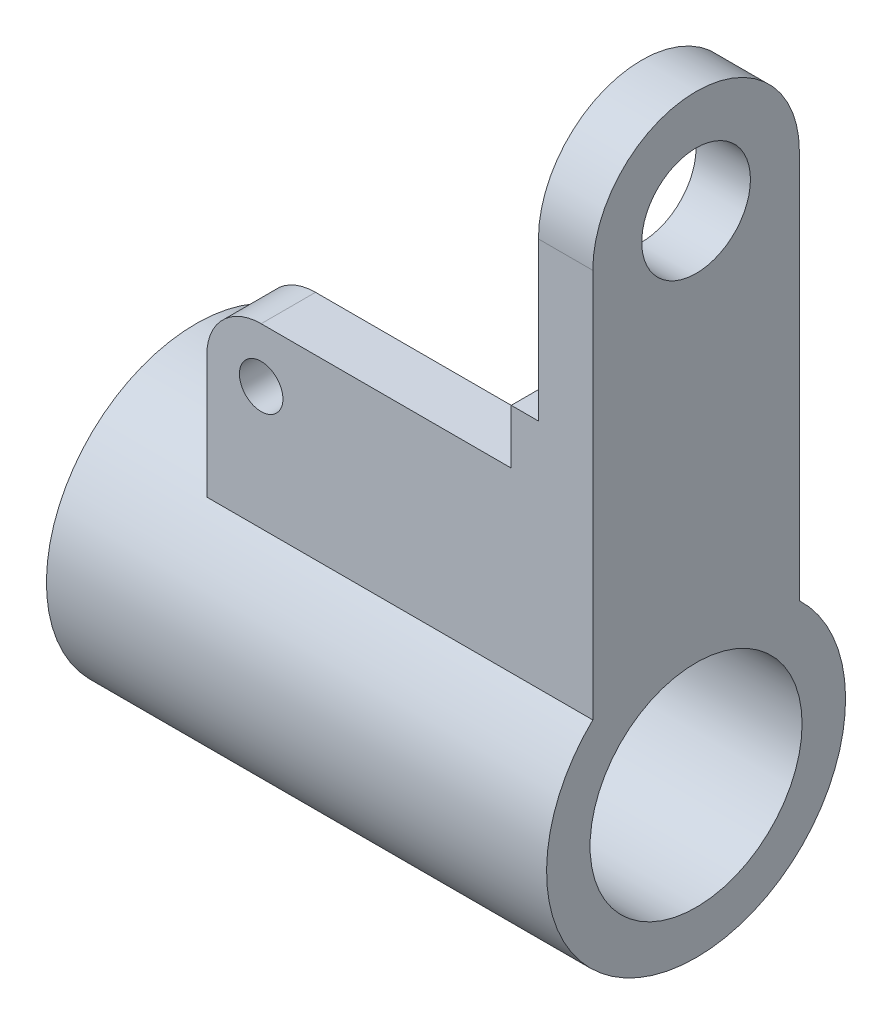
ISO-10303-21;
HEADER;
FILE_DESCRIPTION(('STEP AP214'),'2;1');
FILE_NAME('part.step','',(''),(''),'','','');
FILE_SCHEMA(('AUTOMOTIVE_DESIGN { 1 0 10303 214 1 1 1 1 }'));
ENDSEC;
DATA;
#1=APPLICATION_CONTEXT('core data for automotive mechanical design processes');
#2=APPLICATION_PROTOCOL_DEFINITION('international standard','automotive_design',2000,#1);
#3=PRODUCT_CONTEXT('',#1,'mechanical');
#4=PRODUCT('Part','Part','',(#3));
#5=PRODUCT_RELATED_PRODUCT_CATEGORY('part','',(#4));
#6=PRODUCT_DEFINITION_FORMATION('','',#4);
#7=PRODUCT_DEFINITION_CONTEXT('part definition',#1,'design');
#8=PRODUCT_DEFINITION('design','',#6,#7);
#9=PRODUCT_DEFINITION_SHAPE('','',#8);
#10=(LENGTH_UNIT() NAMED_UNIT(*) SI_UNIT(.MILLI.,.METRE.));
#11=(NAMED_UNIT(*) PLANE_ANGLE_UNIT() SI_UNIT($,.RADIAN.));
#12=(NAMED_UNIT(*) SI_UNIT($,.STERADIAN.) SOLID_ANGLE_UNIT());
#13=UNCERTAINTY_MEASURE_WITH_UNIT(LENGTH_MEASURE(1.E-05),#10,'distance_accuracy_value','');
#14=(GEOMETRIC_REPRESENTATION_CONTEXT(3) GLOBAL_UNCERTAINTY_ASSIGNED_CONTEXT((#13)) GLOBAL_UNIT_ASSIGNED_CONTEXT((#10,
#11,#12)) REPRESENTATION_CONTEXT('',''));
#15=CARTESIAN_POINT('',(0.,0.,0.));
#16=DIRECTION('',(0.,0.,1.));
#17=DIRECTION('',(1.,0.,0.));
#18=AXIS2_PLACEMENT_3D('',#15,#16,#17);
#19=CARTESIAN_POINT('',(92.,0.,0.));
#20=DIRECTION('',(-1.,0.,0.));
#21=DIRECTION('',(0.,0.,1.));
#22=AXIS2_PLACEMENT_3D('',#19,#20,#21);
#23=CYLINDRICAL_SURFACE('',#22,27.5);
#24=CARTESIAN_POINT('',(0.,0.,0.));
#25=DIRECTION('',(1.,0.,0.));
#26=DIRECTION('',(0.,0.,-1.));
#27=AXIS2_PLACEMENT_3D('',#24,#25,#26);
#28=CIRCLE('',#27,27.5);
#29=CARTESIAN_POINT('',(0.,0.,-27.5));
#30=VERTEX_POINT('',#29);
#31=EDGE_CURVE('E195',#30,#30,#28,.T.);
#32=ORIENTED_EDGE('',*,*,#31,.T.);
#33=EDGE_LOOP('',(#32));
#34=FACE_BOUND('',#33,.T.);
#35=DIRECTION('',(1.,0.,0.));
#36=VECTOR('',#35,1.);
#37=CARTESIAN_POINT('',(77.,19.8808953520711,19.));
#38=LINE('',#37,#36);
#39=CARTESIAN_POINT('',(21.,19.880895352071,19.));
#40=VERTEX_POINT('',#39);
#41=CARTESIAN_POINT('',(92.,19.880895352071,19.));
#42=VERTEX_POINT('',#41);
#43=EDGE_CURVE('E183',#40,#42,#38,.T.);
#44=ORIENTED_EDGE('',*,*,#43,.F.);
#45=CARTESIAN_POINT('',(21.,0.,0.));
#46=DIRECTION('',(1.,0.,0.));
#47=DIRECTION('',(0.,0.,1.));
#48=AXIS2_PLACEMENT_3D('',#45,#46,#47);
#49=CIRCLE('',#48,27.5);
#50=CARTESIAN_POINT('',(21.,25.9855729203726,8.99999999999999));
#51=VERTEX_POINT('',#50);
#52=EDGE_CURVE('E131',#51,#40,#49,.T.);
#53=ORIENTED_EDGE('',*,*,#52,.F.);
#54=DIRECTION('',(1.,0.,0.));
#55=VECTOR('',#54,1.);
#56=CARTESIAN_POINT('',(21.,25.9855729203726,8.99999999999999));
#57=LINE('',#56,#55);
#58=CARTESIAN_POINT('',(77.,25.9855729203726,8.99999999999999));
#59=VERTEX_POINT('',#58);
#60=EDGE_CURVE('E129',#51,#59,#57,.T.);
#61=ORIENTED_EDGE('',*,*,#60,.T.);
#62=CARTESIAN_POINT('',(77.,0.,0.));
#63=DIRECTION('',(-1.,0.,0.));
#64=DIRECTION('',(0.,0.,-1.));
#65=AXIS2_PLACEMENT_3D('',#62,#63,#64);
#66=CIRCLE('',#65,27.5);
#67=CARTESIAN_POINT('',(77.,19.8808953520711,-19.));
#68=VERTEX_POINT('',#67);
#69=EDGE_CURVE('E112',#59,#68,#66,.T.);
#70=ORIENTED_EDGE('',*,*,#69,.T.);
#71=DIRECTION('',(1.,0.,0.));
#72=VECTOR('',#71,1.);
#73=CARTESIAN_POINT('',(77.,19.8808953520711,-19.));
#74=LINE('',#73,#72);
#75=CARTESIAN_POINT('',(92.,19.8808953520711,-19.));
#76=VERTEX_POINT('',#75);
#77=EDGE_CURVE('E176',#68,#76,#74,.T.);
#78=ORIENTED_EDGE('',*,*,#77,.T.);
#79=CARTESIAN_POINT('',(92.,0.,0.));
#80=DIRECTION('',(1.,0.,0.));
#81=DIRECTION('',(0.,0.,-1.));
#82=AXIS2_PLACEMENT_3D('',#79,#80,#81);
#83=CIRCLE('',#82,27.5);
#84=EDGE_CURVE('E198',#42,#76,#83,.T.);
#85=ORIENTED_EDGE('',*,*,#84,.F.);
#86=EDGE_LOOP('',(#44,#53,#61,#70,#78,#85));
#87=FACE_BOUND('',#86,.T.);
#88=ADVANCED_FACE('F37',(#34,#87),#23,.T.);
#89=CARTESIAN_POINT('',(77.,0.,0.));
#90=DIRECTION('',(1.,0.,0.));
#91=DIRECTION('',(0.,0.,-1.));
#92=AXIS2_PLACEMENT_3D('',#89,#90,#91);
#93=PLANE('',#92);
#94=DIRECTION('',(0.,0.,-1.));
#95=VECTOR('',#94,1.);
#96=CARTESIAN_POINT('',(77.,52.5,19.));
#97=LINE('',#96,#95);
#98=CARTESIAN_POINT('',(77.,52.5,19.));
#99=VERTEX_POINT('',#98);
#100=CARTESIAN_POINT('',(77.,52.5,8.99999999999999));
#101=VERTEX_POINT('',#100);
#102=EDGE_CURVE('E136',#99,#101,#97,.T.);
#103=ORIENTED_EDGE('',*,*,#102,.F.);
#104=DIRECTION('',(0.,-1.,0.));
#105=VECTOR('',#104,1.);
#106=CARTESIAN_POINT('',(77.,19.8808953520711,19.));
#107=LINE('',#106,#105);
#108=CARTESIAN_POINT('',(77.,62.5,19.));
#109=VERTEX_POINT('',#108);
#110=EDGE_CURVE('E173',#109,#99,#107,.T.);
#111=ORIENTED_EDGE('',*,*,#110,.F.);
#112=DIRECTION('',(0.,0.,1.));
#113=VECTOR('',#112,1.);
#114=CARTESIAN_POINT('',(77.,62.5,-27.501));
#115=LINE('',#114,#113);
#116=CARTESIAN_POINT('',(77.,62.5,-19.));
#117=VERTEX_POINT('',#116);
#118=EDGE_CURVE('E166',#117,#109,#115,.T.);
#119=ORIENTED_EDGE('',*,*,#118,.F.);
#120=DIRECTION('',(0.,1.,0.));
#121=VECTOR('',#120,1.);
#122=CARTESIAN_POINT('',(77.,19.8808953520711,-19.));
#123=LINE('',#122,#121);
#124=EDGE_CURVE('E121',#68,#117,#123,.T.);
#125=ORIENTED_EDGE('',*,*,#124,.F.);
#126=ORIENTED_EDGE('',*,*,#69,.F.);
#127=DIRECTION('',(0.,-1.,0.));
#128=VECTOR('',#127,1.);
#129=CARTESIAN_POINT('',(77.,52.5,8.99999999999999));
#130=LINE('',#129,#128);
#131=EDGE_CURVE('E117',#101,#59,#130,.T.);
#132=ORIENTED_EDGE('',*,*,#131,.F.);
#133=EDGE_LOOP('',(#103,#111,#119,#125,#126,#132));
#134=FACE_BOUND('',#133,.T.);
#135=ADVANCED_FACE('F115',(#134),#93,.F.);
#136=CARTESIAN_POINT('',(92.,0.,0.));
#137=DIRECTION('',(1.,0.,0.));
#138=DIRECTION('',(0.,0.,-1.));
#139=AXIS2_PLACEMENT_3D('',#136,#137,#138);
#140=PLANE('',#139);
#141=ORIENTED_EDGE('',*,*,#84,.T.);
#142=DIRECTION('',(0.,1.,0.));
#143=VECTOR('',#142,1.);
#144=CARTESIAN_POINT('',(92.,19.8808953520711,-19.));
#145=LINE('',#144,#143);
#146=CARTESIAN_POINT('',(92.,91.5,-19.));
#147=VERTEX_POINT('',#146);
#148=EDGE_CURVE('E170',#76,#147,#145,.T.);
#149=ORIENTED_EDGE('',*,*,#148,.T.);
#150=CARTESIAN_POINT('',(92.,91.5,0.));
#151=DIRECTION('',(1.,0.,0.));
#152=DIRECTION('',(0.,0.,-1.));
#153=AXIS2_PLACEMENT_3D('',#150,#151,#152);
#154=CIRCLE('',#153,19.);
#155=CARTESIAN_POINT('',(92.,91.5,19.));
#156=VERTEX_POINT('',#155);
#157=EDGE_CURVE('E179',#147,#156,#154,.T.);
#158=ORIENTED_EDGE('',*,*,#157,.T.);
#159=DIRECTION('',(0.,-1.,0.));
#160=VECTOR('',#159,1.);
#161=CARTESIAN_POINT('',(92.,19.8808953520711,19.));
#162=LINE('',#161,#160);
#163=EDGE_CURVE('E125',#156,#42,#162,.T.);
#164=ORIENTED_EDGE('',*,*,#163,.T.);
#165=EDGE_LOOP('',(#141,#149,#158,#164));
#166=FACE_BOUND('',#165,.T.);
#167=CARTESIAN_POINT('',(92.,0.,0.));
#168=DIRECTION('',(1.,0.,0.));
#169=DIRECTION('',(0.,0.,-1.));
#170=AXIS2_PLACEMENT_3D('',#167,#168,#169);
#171=CIRCLE('',#170,19.5);
#172=CARTESIAN_POINT('',(92.,0.,-19.5));
#173=VERTEX_POINT('',#172);
#174=EDGE_CURVE('E192',#173,#173,#171,.T.);
#175=ORIENTED_EDGE('',*,*,#174,.F.);
#176=EDGE_LOOP('',(#175));
#177=FACE_BOUND('',#176,.T.);
#178=CARTESIAN_POINT('',(92.,91.5,0.));
#179=DIRECTION('',(1.,0.,0.));
#180=DIRECTION('',(0.,0.,-1.));
#181=AXIS2_PLACEMENT_3D('',#178,#179,#180);
#182=CIRCLE('',#181,10.);
#183=CARTESIAN_POINT('',(92.,91.5,-10.));
#184=VERTEX_POINT('',#183);
#185=EDGE_CURVE('E154',#184,#184,#182,.T.);
#186=ORIENTED_EDGE('',*,*,#185,.F.);
#187=EDGE_LOOP('',(#186));
#188=FACE_BOUND('',#187,.T.);
#189=ADVANCED_FACE('F244',(#166,#177,#188),#140,.T.);
#190=CARTESIAN_POINT('',(0.,0.,0.));
#191=DIRECTION('',(1.,0.,0.));
#192=DIRECTION('',(0.,0.,-1.));
#193=AXIS2_PLACEMENT_3D('',#190,#191,#192);
#194=PLANE('',#193);
#195=ORIENTED_EDGE('',*,*,#31,.F.);
#196=EDGE_LOOP('',(#195));
#197=FACE_BOUND('',#196,.T.);
#198=CARTESIAN_POINT('',(0.,0.,0.));
#199=DIRECTION('',(1.,0.,0.));
#200=DIRECTION('',(0.,0.,-1.));
#201=AXIS2_PLACEMENT_3D('',#198,#199,#200);
#202=CIRCLE('',#201,19.5);
#203=CARTESIAN_POINT('',(0.,0.,-19.5));
#204=VERTEX_POINT('',#203);
#205=EDGE_CURVE('E186',#204,#204,#202,.T.);
#206=ORIENTED_EDGE('',*,*,#205,.T.);
#207=EDGE_LOOP('',(#206));
#208=FACE_BOUND('',#207,.T.);
#209=ADVANCED_FACE('F247',(#197,#208),#194,.F.);
#210=CARTESIAN_POINT('',(92.,0.,0.));
#211=DIRECTION('',(-1.,0.,0.));
#212=DIRECTION('',(0.,0.,1.));
#213=AXIS2_PLACEMENT_3D('',#210,#211,#212);
#214=CYLINDRICAL_SURFACE('',#213,19.5);
#215=ORIENTED_EDGE('',*,*,#174,.T.);
#216=EDGE_LOOP('',(#215));
#217=FACE_BOUND('',#216,.T.);
#218=ORIENTED_EDGE('',*,*,#205,.F.);
#219=EDGE_LOOP('',(#218));
#220=FACE_BOUND('',#219,.T.);
#221=ADVANCED_FACE('F228',(#217,#220),#214,.F.);
#222=CARTESIAN_POINT('',(77.,19.8808953520711,19.));
#223=DIRECTION('',(0.,0.,1.));
#224=DIRECTION('',(1.,0.,0.));
#225=AXIS2_PLACEMENT_3D('',#222,#223,#224);
#226=PLANE('',#225);
#227=CARTESIAN_POINT('',(31.,42.5,19.));
#228=DIRECTION('',(0.,0.,1.));
#229=DIRECTION('',(1.,0.,0.));
#230=AXIS2_PLACEMENT_3D('',#227,#228,#229);
#231=CIRCLE('',#230,4.00000000000001);
#232=CARTESIAN_POINT('',(35.,42.5,19.));
#233=VERTEX_POINT('',#232);
#234=EDGE_CURVE('E217',#233,#233,#231,.T.);
#235=ORIENTED_EDGE('',*,*,#234,.F.);
#236=EDGE_LOOP('',(#235));
#237=FACE_BOUND('',#236,.T.);
#238=DIRECTION('',(1.,0.,0.));
#239=VECTOR('',#238,1.);
#240=CARTESIAN_POINT('',(21.,52.5,19.));
#241=LINE('',#240,#239);
#242=CARTESIAN_POINT('',(31.,52.5,19.));
#243=VERTEX_POINT('',#242);
#244=EDGE_CURVE('E145',#243,#99,#241,.T.);
#245=ORIENTED_EDGE('',*,*,#244,.F.);
#246=CARTESIAN_POINT('',(31.,42.5,19.));
#247=DIRECTION('',(0.,0.,1.));
#248=DIRECTION('',(1.,0.,0.));
#249=AXIS2_PLACEMENT_3D('',#246,#247,#248);
#250=CIRCLE('',#249,10.);
#251=CARTESIAN_POINT('',(21.,42.5,19.));
#252=VERTEX_POINT('',#251);
#253=EDGE_CURVE('E11',#243,#252,#250,.T.);
#254=ORIENTED_EDGE('',*,*,#253,.T.);
#255=DIRECTION('',(0.,1.,0.));
#256=VECTOR('',#255,1.);
#257=CARTESIAN_POINT('',(21.,19.8808953520711,19.));
#258=LINE('',#257,#256);
#259=EDGE_CURVE('E138',#40,#252,#258,.T.);
#260=ORIENTED_EDGE('',*,*,#259,.F.);
#261=ORIENTED_EDGE('',*,*,#43,.T.);
#262=ORIENTED_EDGE('',*,*,#163,.F.);
#263=DIRECTION('',(1.,0.,0.));
#264=VECTOR('',#263,1.);
#265=CARTESIAN_POINT('',(77.,91.5,19.));
#266=LINE('',#265,#264);
#267=CARTESIAN_POINT('',(82.,91.5,19.));
#268=VERTEX_POINT('',#267);
#269=EDGE_CURVE('E187',#268,#156,#266,.T.);
#270=ORIENTED_EDGE('',*,*,#269,.F.);
#271=DIRECTION('',(0.,1.,0.));
#272=VECTOR('',#271,1.);
#273=CARTESIAN_POINT('',(82.,110.5,19.));
#274=LINE('',#273,#272);
#275=CARTESIAN_POINT('',(82.,62.5,19.));
#276=VERTEX_POINT('',#275);
#277=EDGE_CURVE('E164',#276,#268,#274,.T.);
#278=ORIENTED_EDGE('',*,*,#277,.F.);
#279=DIRECTION('',(1.,0.,0.));
#280=VECTOR('',#279,1.);
#281=CARTESIAN_POINT('',(82.,62.5,19.));
#282=LINE('',#281,#280);
#283=EDGE_CURVE('E161',#109,#276,#282,.T.);
#284=ORIENTED_EDGE('',*,*,#283,.F.);
#285=ORIENTED_EDGE('',*,*,#110,.T.);
#286=EDGE_LOOP('',(#245,#254,#260,#261,#262,#270,#278,#284,#285));
#287=FACE_BOUND('',#286,.T.);
#288=ADVANCED_FACE('F224',(#237,#287),#226,.T.);
#289=CARTESIAN_POINT('',(77.,91.5,0.));
#290=DIRECTION('',(1.,0.,0.));
#291=DIRECTION('',(0.,0.,-1.));
#292=AXIS2_PLACEMENT_3D('',#289,#290,#291);
#293=CYLINDRICAL_SURFACE('',#292,19.);
#294=CARTESIAN_POINT('',(82.,91.5,0.));
#295=DIRECTION('',(1.,0.,0.));
#296=DIRECTION('',(0.,1.,0.));
#297=AXIS2_PLACEMENT_3D('',#294,#295,#296);
#298=CIRCLE('',#297,19.);
#299=CARTESIAN_POINT('',(82.,91.5,-19.));
#300=VERTEX_POINT('',#299);
#301=EDGE_CURVE('E147',#300,#268,#298,.T.);
#302=ORIENTED_EDGE('',*,*,#301,.T.);
#303=ORIENTED_EDGE('',*,*,#269,.T.);
#304=ORIENTED_EDGE('',*,*,#157,.F.);
#305=DIRECTION('',(1.,0.,0.));
#306=VECTOR('',#305,1.);
#307=CARTESIAN_POINT('',(77.,91.5,-19.));
#308=LINE('',#307,#306);
#309=EDGE_CURVE('E189',#300,#147,#308,.T.);
#310=ORIENTED_EDGE('',*,*,#309,.F.);
#311=EDGE_LOOP('',(#302,#303,#304,#310));
#312=FACE_BOUND('',#311,.T.);
#313=ADVANCED_FACE('F227',(#312),#293,.T.);
#314=CARTESIAN_POINT('',(77.,19.8808953520711,-19.));
#315=DIRECTION('',(0.,0.,-1.));
#316=DIRECTION('',(-1.,0.,0.));
#317=AXIS2_PLACEMENT_3D('',#314,#315,#316);
#318=PLANE('',#317);
#319=DIRECTION('',(0.,1.,0.));
#320=VECTOR('',#319,1.);
#321=CARTESIAN_POINT('',(82.,110.5,-19.));
#322=LINE('',#321,#320);
#323=CARTESIAN_POINT('',(82.,62.5,-19.));
#324=VERTEX_POINT('',#323);
#325=EDGE_CURVE('E158',#324,#300,#322,.T.);
#326=ORIENTED_EDGE('',*,*,#325,.T.);
#327=ORIENTED_EDGE('',*,*,#309,.T.);
#328=ORIENTED_EDGE('',*,*,#148,.F.);
#329=ORIENTED_EDGE('',*,*,#77,.F.);
#330=ORIENTED_EDGE('',*,*,#124,.T.);
#331=DIRECTION('',(1.,0.,0.));
#332=VECTOR('',#331,1.);
#333=CARTESIAN_POINT('',(82.,62.5,-19.));
#334=LINE('',#333,#332);
#335=EDGE_CURVE('E150',#117,#324,#334,.T.);
#336=ORIENTED_EDGE('',*,*,#335,.T.);
#337=EDGE_LOOP('',(#326,#327,#328,#329,#330,#336));
#338=FACE_BOUND('',#337,.T.);
#339=ADVANCED_FACE('F257',(#338),#318,.T.);
#340=CARTESIAN_POINT('',(77.,91.5,0.));
#341=DIRECTION('',(1.,0.,0.));
#342=DIRECTION('',(0.,0.,-1.));
#343=AXIS2_PLACEMENT_3D('',#340,#341,#342);
#344=CYLINDRICAL_SURFACE('',#343,10.);
#345=CARTESIAN_POINT('',(82.,91.5,0.));
#346=DIRECTION('',(1.,0.,0.));
#347=DIRECTION('',(0.,1.,0.));
#348=AXIS2_PLACEMENT_3D('',#345,#346,#347);
#349=CIRCLE('',#348,10.);
#350=CARTESIAN_POINT('',(82.,101.5,0.));
#351=VERTEX_POINT('',#350);
#352=EDGE_CURVE('E151',#351,#351,#349,.T.);
#353=ORIENTED_EDGE('',*,*,#352,.F.);
#354=EDGE_LOOP('',(#353));
#355=FACE_BOUND('',#354,.T.);
#356=ORIENTED_EDGE('',*,*,#185,.T.);
#357=EDGE_LOOP('',(#356));
#358=FACE_BOUND('',#357,.T.);
#359=ADVANCED_FACE('F260',(#355,#358),#344,.F.);
#360=CARTESIAN_POINT('',(82.,110.5,-27.501));
#361=DIRECTION('',(1.,0.,0.));
#362=DIRECTION('',(0.,1.,0.));
#363=AXIS2_PLACEMENT_3D('',#360,#361,#362);
#364=PLANE('',#363);
#365=ORIENTED_EDGE('',*,*,#352,.T.);
#366=EDGE_LOOP('',(#365));
#367=FACE_BOUND('',#366,.T.);
#368=ORIENTED_EDGE('',*,*,#301,.F.);
#369=ORIENTED_EDGE('',*,*,#325,.F.);
#370=DIRECTION('',(0.,0.,1.));
#371=VECTOR('',#370,1.);
#372=CARTESIAN_POINT('',(82.,62.5,-27.501));
#373=LINE('',#372,#371);
#374=EDGE_CURVE('E155',#324,#276,#373,.T.);
#375=ORIENTED_EDGE('',*,*,#374,.T.);
#376=ORIENTED_EDGE('',*,*,#277,.T.);
#377=EDGE_LOOP('',(#368,#369,#375,#376));
#378=FACE_BOUND('',#377,.T.);
#379=ADVANCED_FACE('F267',(#367,#378),#364,.F.);
#380=CARTESIAN_POINT('',(82.,62.5,-27.501));
#381=DIRECTION('',(0.,-1.,0.));
#382=DIRECTION('',(1.,0.,0.));
#383=AXIS2_PLACEMENT_3D('',#380,#381,#382);
#384=PLANE('',#383);
#385=ORIENTED_EDGE('',*,*,#118,.T.);
#386=ORIENTED_EDGE('',*,*,#283,.T.);
#387=ORIENTED_EDGE('',*,*,#374,.F.);
#388=ORIENTED_EDGE('',*,*,#335,.F.);
#389=EDGE_LOOP('',(#385,#386,#387,#388));
#390=FACE_BOUND('',#389,.T.);
#391=ADVANCED_FACE('F269',(#390),#384,.F.);
#392=CARTESIAN_POINT('',(21.,52.5,19.));
#393=DIRECTION('',(0.,-1.,0.));
#394=DIRECTION('',(0.,0.,-1.));
#395=AXIS2_PLACEMENT_3D('',#392,#393,#394);
#396=PLANE('',#395);
#397=DIRECTION('',(1.,0.,0.));
#398=VECTOR('',#397,1.);
#399=CARTESIAN_POINT('',(21.,52.5,8.99999999999999));
#400=LINE('',#399,#398);
#401=CARTESIAN_POINT('',(31.,52.5,8.99999999999999));
#402=VERTEX_POINT('',#401);
#403=EDGE_CURVE('E132',#402,#101,#400,.T.);
#404=ORIENTED_EDGE('',*,*,#403,.F.);
#405=DIRECTION('',(0.,0.,-1.));
#406=VECTOR('',#405,1.);
#407=CARTESIAN_POINT('',(31.,52.5,19.));
#408=LINE('',#407,#406);
#409=EDGE_CURVE('E45',#402,#243,#408,.F.);
#410=ORIENTED_EDGE('',*,*,#409,.T.);
#411=ORIENTED_EDGE('',*,*,#244,.T.);
#412=ORIENTED_EDGE('',*,*,#102,.T.);
#413=EDGE_LOOP('',(#404,#410,#411,#412));
#414=FACE_BOUND('',#413,.T.);
#415=ADVANCED_FACE('F272',(#414),#396,.F.);
#416=CARTESIAN_POINT('',(21.,52.5,8.99999999999999));
#417=DIRECTION('',(0.,0.,1.));
#418=DIRECTION('',(0.,-1.,0.));
#419=AXIS2_PLACEMENT_3D('',#416,#417,#418);
#420=PLANE('',#419);
#421=CARTESIAN_POINT('',(31.,42.5,8.99999999999999));
#422=DIRECTION('',(0.,0.,1.));
#423=DIRECTION('',(0.,-1.,0.));
#424=AXIS2_PLACEMENT_3D('',#421,#422,#423);
#425=CIRCLE('',#424,4.00000000000001);
#426=CARTESIAN_POINT('',(35.,42.5,8.99999999999998));
#427=VERTEX_POINT('',#426);
#428=EDGE_CURVE('E140',#427,#427,#425,.F.);
#429=ORIENTED_EDGE('',*,*,#428,.F.);
#430=EDGE_LOOP('',(#429));
#431=FACE_BOUND('',#430,.T.);
#432=DIRECTION('',(0.,-1.,0.));
#433=VECTOR('',#432,1.);
#434=CARTESIAN_POINT('',(21.,52.5,8.99999999999999));
#435=LINE('',#434,#433);
#436=CARTESIAN_POINT('',(21.,42.5,8.99999999999999));
#437=VERTEX_POINT('',#436);
#438=EDGE_CURVE('E133',#437,#51,#435,.T.);
#439=ORIENTED_EDGE('',*,*,#438,.F.);
#440=CARTESIAN_POINT('',(31.,42.5,8.99999999999999));
#441=DIRECTION('',(0.,0.,1.));
#442=DIRECTION('',(0.,-1.,0.));
#443=AXIS2_PLACEMENT_3D('',#440,#441,#442);
#444=CIRCLE('',#443,10.);
#445=EDGE_CURVE('E59',#437,#402,#444,.F.);
#446=ORIENTED_EDGE('',*,*,#445,.T.);
#447=ORIENTED_EDGE('',*,*,#403,.T.);
#448=ORIENTED_EDGE('',*,*,#131,.T.);
#449=ORIENTED_EDGE('',*,*,#60,.F.);
#450=EDGE_LOOP('',(#439,#446,#447,#448,#449));
#451=FACE_BOUND('',#450,.T.);
#452=ADVANCED_FACE('F135',(#431,#451),#420,.F.);
#453=CARTESIAN_POINT('',(21.,0.,0.));
#454=DIRECTION('',(-1.,0.,0.));
#455=DIRECTION('',(0.,0.,1.));
#456=AXIS2_PLACEMENT_3D('',#453,#454,#455);
#457=PLANE('',#456);
#458=ORIENTED_EDGE('',*,*,#259,.T.);
#459=DIRECTION('',(0.,0.,-1.));
#460=VECTOR('',#459,1.);
#461=CARTESIAN_POINT('',(21.,42.5,8.99999999999999));
#462=LINE('',#461,#460);
#463=EDGE_CURVE('E201',#252,#437,#462,.T.);
#464=ORIENTED_EDGE('',*,*,#463,.T.);
#465=ORIENTED_EDGE('',*,*,#438,.T.);
#466=ORIENTED_EDGE('',*,*,#52,.T.);
#467=EDGE_LOOP('',(#458,#464,#465,#466));
#468=FACE_BOUND('',#467,.T.);
#469=ADVANCED_FACE('F209',(#468),#457,.T.);
#470=CARTESIAN_POINT('',(31.,42.5,0.));
#471=DIRECTION('',(0.,0.,1.));
#472=DIRECTION('',(1.,0.,0.));
#473=AXIS2_PLACEMENT_3D('',#470,#471,#472);
#474=CYLINDRICAL_SURFACE('',#473,10.);
#475=ORIENTED_EDGE('',*,*,#253,.F.);
#476=ORIENTED_EDGE('',*,*,#409,.F.);
#477=ORIENTED_EDGE('',*,*,#445,.F.);
#478=ORIENTED_EDGE('',*,*,#463,.F.);
#479=EDGE_LOOP('',(#475,#476,#477,#478));
#480=FACE_BOUND('',#479,.T.);
#481=ADVANCED_FACE('F39',(#480),#474,.T.);
#482=CARTESIAN_POINT('',(31.,42.5,-27.501));
#483=DIRECTION('',(0.,0.,1.));
#484=DIRECTION('',(1.,0.,0.));
#485=AXIS2_PLACEMENT_3D('',#482,#483,#484);
#486=CYLINDRICAL_SURFACE('',#485,4.00000000000001);
#487=CARTESIAN_POINT('',(35.,42.5,19.));
#488=CARTESIAN_POINT('',(35.,42.5,18.8958333333333));
#489=CARTESIAN_POINT('',(35.,42.5,18.7916666666667));
#490=CARTESIAN_POINT('',(35.,42.5,18.5833333333333));
#491=CARTESIAN_POINT('',(35.,42.5,18.4791666666667));
#492=CARTESIAN_POINT('',(35.,42.5,18.2708333333333));
#493=CARTESIAN_POINT('',(35.,42.5,18.1666666666667));
#494=CARTESIAN_POINT('',(35.,42.5,17.9583333333333));
#495=CARTESIAN_POINT('',(35.,42.5,17.8541666666667));
#496=CARTESIAN_POINT('',(35.,42.5,17.6458333333333));
#497=CARTESIAN_POINT('',(35.,42.5,17.5416666666667));
#498=CARTESIAN_POINT('',(35.,42.5,17.3333333333333));
#499=CARTESIAN_POINT('',(35.,42.5,17.2291666666667));
#500=CARTESIAN_POINT('',(35.,42.5,17.0208333333333));
#501=CARTESIAN_POINT('',(35.,42.5,16.9166666666667));
#502=CARTESIAN_POINT('',(35.,42.5,16.7083333333333));
#503=CARTESIAN_POINT('',(35.,42.5,16.6041666666667));
#504=CARTESIAN_POINT('',(35.,42.5,16.3958333333333));
#505=CARTESIAN_POINT('',(35.,42.5,16.2916666666667));
#506=CARTESIAN_POINT('',(35.,42.5,16.0833333333333));
#507=CARTESIAN_POINT('',(35.,42.5,15.9791666666667));
#508=CARTESIAN_POINT('',(35.,42.5,15.7708333333333));
#509=CARTESIAN_POINT('',(35.,42.5,15.6666666666667));
#510=CARTESIAN_POINT('',(35.,42.5,15.4583333333333));
#511=CARTESIAN_POINT('',(35.,42.5,15.3541666666667));
#512=CARTESIAN_POINT('',(35.,42.5,15.1458333333333));
#513=CARTESIAN_POINT('',(35.,42.5,15.0416666666667));
#514=CARTESIAN_POINT('',(35.,42.5,14.8333333333333));
#515=CARTESIAN_POINT('',(35.,42.5,14.7291666666667));
#516=CARTESIAN_POINT('',(35.,42.5,14.5208333333333));
#517=CARTESIAN_POINT('',(35.,42.5,14.4166666666667));
#518=CARTESIAN_POINT('',(35.,42.5,14.2083333333333));
#519=CARTESIAN_POINT('',(35.,42.5,14.1041666666667));
#520=CARTESIAN_POINT('',(35.,42.5,13.8958333333333));
#521=CARTESIAN_POINT('',(35.,42.5,13.7916666666667));
#522=CARTESIAN_POINT('',(35.,42.5,13.5833333333333));
#523=CARTESIAN_POINT('',(35.,42.5,13.4791666666667));
#524=CARTESIAN_POINT('',(35.,42.5,13.2708333333333));
#525=CARTESIAN_POINT('',(35.,42.5,13.1666666666667));
#526=CARTESIAN_POINT('',(35.,42.5,12.9583333333333));
#527=CARTESIAN_POINT('',(35.,42.5,12.8541666666667));
#528=CARTESIAN_POINT('',(35.,42.5,12.6458333333333));
#529=CARTESIAN_POINT('',(35.,42.5,12.5416666666667));
#530=CARTESIAN_POINT('',(35.,42.5,12.3333333333333));
#531=CARTESIAN_POINT('',(35.,42.5,12.2291666666667));
#532=CARTESIAN_POINT('',(35.,42.5,12.0208333333333));
#533=CARTESIAN_POINT('',(35.,42.5,11.9166666666667));
#534=CARTESIAN_POINT('',(35.,42.5,11.7083333333333));
#535=CARTESIAN_POINT('',(35.,42.5,11.6041666666667));
#536=CARTESIAN_POINT('',(35.,42.5,11.3958333333333));
#537=CARTESIAN_POINT('',(35.,42.5,11.2916666666667));
#538=CARTESIAN_POINT('',(35.,42.5,11.0833333333333));
#539=CARTESIAN_POINT('',(35.,42.5,10.9791666666667));
#540=CARTESIAN_POINT('',(35.,42.5,10.7708333333333));
#541=CARTESIAN_POINT('',(35.,42.5,10.6666666666667));
#542=CARTESIAN_POINT('',(35.,42.5,10.4583333333333));
#543=CARTESIAN_POINT('',(35.,42.5,10.3541666666667));
#544=CARTESIAN_POINT('',(35.,42.5,10.1458333333333));
#545=CARTESIAN_POINT('',(35.,42.5,10.0416666666667));
#546=CARTESIAN_POINT('',(35.,42.5,9.83333333333332));
#547=CARTESIAN_POINT('',(35.,42.5,9.72916666666665));
#548=CARTESIAN_POINT('',(35.,42.5,9.52083333333332));
#549=CARTESIAN_POINT('',(35.,42.5,9.41666666666665));
#550=CARTESIAN_POINT('',(35.,42.5,9.20833333333332));
#551=CARTESIAN_POINT('',(35.,42.5,9.10416666666665));
#552=CARTESIAN_POINT('',(35.,42.5,8.99999999999998));
#553=B_SPLINE_CURVE_WITH_KNOTS('',3,(#487,#488,#489,#490,#491,#492,#493,#494,#495,#496,#497,
#498,#499,#500,#501,#502,#503,#504,#505,#506,#507,#508,#509,#510,#511,#512,#513,#514,#515,#516,
#517,#518,#519,#520,#521,#522,#523,#524,#525,#526,#527,#528,#529,#530,#531,#532,#533,#534,#535,
#536,#537,#538,#539,#540,#541,#542,#543,#544,#545,#546,#547,#548,#549,#550,#551,#552),
.UNSPECIFIED.,.F.,.F.,(4,2,2,2,2,2,2,2,2,2,2,2,2,2,2,2,2,2,2,2,2,2,2,2,2,2,2,2,2,2,2,2,4),(0.,
0.3125,0.625000000000001,0.937500000000001,1.25,1.5625,1.875,2.1875,2.5,2.8125,3.125,3.4375,
3.75,4.0625,4.375,4.6875,5.,5.3125,5.62500000000001,5.93750000000001,6.25000000000001,
6.56250000000001,6.87500000000001,7.18750000000001,7.50000000000001,7.81250000000001,
8.12500000000001,8.43750000000001,8.75000000000001,9.06250000000001,9.37500000000001,
9.68750000000001,10.),.UNSPECIFIED.);
#554=EDGE_CURVE('BSEAM221',#233,#427,#553,.T.);
#555=ORIENTED_EDGE('',*,*,#234,.T.);
#556=ORIENTED_EDGE('',*,*,#428,.T.);
#557=ORIENTED_EDGE('',*,*,#554,.T.);
#558=ORIENTED_EDGE('',*,*,#554,.F.);
#559=EDGE_LOOP('',(#555,#557,#556,#558));
#560=FACE_BOUND('',#559,.T.);
#561=ADVANCED_FACE('F221',(#560),#486,.F.);
#562=CLOSED_SHELL('',(#88,#135,#189,#209,#221,#288,#313,#339,#359,#379,#391,#415,#452,#469,#481,#561));
#563=MANIFOLD_SOLID_BREP('B2',#562);
#564=ADVANCED_BREP_SHAPE_REPRESENTATION('',(#18,#563),#14);
#565=SHAPE_DEFINITION_REPRESENTATION(#9,#564);
ENDSEC;
END-ISO-10303-21;
